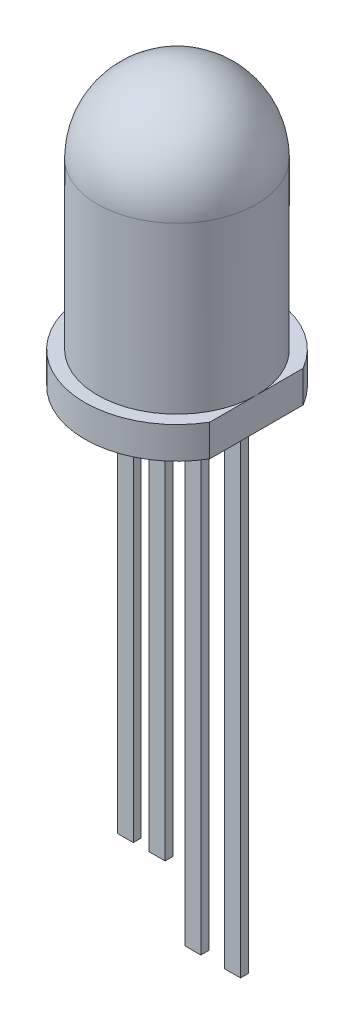
ISO-10303-21;
HEADER;
FILE_DESCRIPTION(('STEP AP214'),'2;1');
FILE_NAME('part.step','',(''),(''),'','','');
FILE_SCHEMA(('AUTOMOTIVE_DESIGN { 1 0 10303 214 1 1 1 1 }'));
ENDSEC;
DATA;
#1=APPLICATION_CONTEXT('core data for automotive mechanical design processes');
#2=APPLICATION_PROTOCOL_DEFINITION('international standard','automotive_design',2000,#1);
#3=PRODUCT_CONTEXT('',#1,'mechanical');
#4=PRODUCT('Part','Part','',(#3));
#5=PRODUCT_RELATED_PRODUCT_CATEGORY('part','',(#4));
#6=PRODUCT_DEFINITION_FORMATION('','',#4);
#7=PRODUCT_DEFINITION_CONTEXT('part definition',#1,'design');
#8=PRODUCT_DEFINITION('design','',#6,#7);
#9=PRODUCT_DEFINITION_SHAPE('','',#8);
#10=(LENGTH_UNIT() NAMED_UNIT(*) SI_UNIT(.MILLI.,.METRE.));
#11=(NAMED_UNIT(*) PLANE_ANGLE_UNIT() SI_UNIT($,.RADIAN.));
#12=(NAMED_UNIT(*) SI_UNIT($,.STERADIAN.) SOLID_ANGLE_UNIT());
#13=UNCERTAINTY_MEASURE_WITH_UNIT(LENGTH_MEASURE(1.E-05),#10,'distance_accuracy_value','');
#14=(GEOMETRIC_REPRESENTATION_CONTEXT(3) GLOBAL_UNCERTAINTY_ASSIGNED_CONTEXT((#13)) GLOBAL_UNIT_ASSIGNED_CONTEXT((#10,
#11,#12)) REPRESENTATION_CONTEXT('',''));
#15=CARTESIAN_POINT('',(0.,0.,0.));
#16=DIRECTION('',(0.,0.,1.));
#17=DIRECTION('',(1.,0.,0.));
#18=AXIS2_PLACEMENT_3D('',#15,#16,#17);
#19=CARTESIAN_POINT('',(0.,0.,0.));
#20=DIRECTION('',(0.,-1.,0.));
#21=DIRECTION('',(0.,0.,-1.));
#22=AXIS2_PLACEMENT_3D('',#19,#20,#21);
#23=PLANE('',#22);
#24=DIRECTION('',(-1.,0.,0.));
#25=VECTOR('',#24,1.);
#26=CARTESIAN_POINT('',(1.625,0.,0.125));
#27=LINE('',#26,#25);
#28=CARTESIAN_POINT('',(2.125,0.,0.125));
#29=VERTEX_POINT('',#28);
#30=CARTESIAN_POINT('',(1.625,0.,0.125));
#31=VERTEX_POINT('',#30);
#32=EDGE_CURVE('E237',#29,#31,#27,.T.);
#33=ORIENTED_EDGE('',*,*,#32,.F.);
#34=DIRECTION('',(0.,0.,-1.));
#35=VECTOR('',#34,1.);
#36=CARTESIAN_POINT('',(2.125,0.,0.125));
#37=LINE('',#36,#35);
#38=CARTESIAN_POINT('',(2.125,0.,-0.125));
#39=VERTEX_POINT('',#38);
#40=EDGE_CURVE('E250',#29,#39,#37,.T.);
#41=ORIENTED_EDGE('',*,*,#40,.T.);
#42=DIRECTION('',(-1.,0.,0.));
#43=VECTOR('',#42,1.);
#44=CARTESIAN_POINT('',(1.625,0.,-0.125));
#45=LINE('',#44,#43);
#46=CARTESIAN_POINT('',(1.625,0.,-0.125));
#47=VERTEX_POINT('',#46);
#48=EDGE_CURVE('E233',#39,#47,#45,.T.);
#49=ORIENTED_EDGE('',*,*,#48,.T.);
#50=DIRECTION('',(0.,0.,-1.));
#51=VECTOR('',#50,1.);
#52=CARTESIAN_POINT('',(1.625,0.,0.125));
#53=LINE('',#52,#51);
#54=EDGE_CURVE('E239',#31,#47,#53,.T.);
#55=ORIENTED_EDGE('',*,*,#54,.F.);
#56=EDGE_LOOP('',(#33,#41,#49,#55));
#57=FACE_BOUND('',#56,.T.);
#58=CARTESIAN_POINT('',(0.,0.,0.));
#59=DIRECTION('',(0.,-1.,0.));
#60=DIRECTION('',(0.,0.,-1.));
#61=AXIS2_PLACEMENT_3D('',#58,#59,#60);
#62=CIRCLE('',#61,2.9);
#63=CARTESIAN_POINT('',(2.5,0.,1.46969384566991));
#64=VERTEX_POINT('',#63);
#65=CARTESIAN_POINT('',(2.5,0.,-1.46969384566991));
#66=VERTEX_POINT('',#65);
#67=EDGE_CURVE('E301',#64,#66,#62,.T.);
#68=ORIENTED_EDGE('',*,*,#67,.T.);
#69=DIRECTION('',(0.,0.,1.));
#70=VECTOR('',#69,1.);
#71=CARTESIAN_POINT('',(2.5,0.,-1.46969384566991));
#72=LINE('',#71,#70);
#73=EDGE_CURVE('E289',#66,#64,#72,.T.);
#74=ORIENTED_EDGE('',*,*,#73,.T.);
#75=EDGE_LOOP('',(#68,#74));
#76=FACE_BOUND('',#75,.T.);
#77=DIRECTION('',(0.,0.,-1.));
#78=VECTOR('',#77,1.);
#79=CARTESIAN_POINT('',(0.375,0.,0.125));
#80=LINE('',#79,#78);
#81=CARTESIAN_POINT('',(0.375,0.,0.125));
#82=VERTEX_POINT('',#81);
#83=CARTESIAN_POINT('',(0.375,0.,-0.125));
#84=VERTEX_POINT('',#83);
#85=EDGE_CURVE('E284',#82,#84,#80,.T.);
#86=ORIENTED_EDGE('',*,*,#85,.F.);
#87=DIRECTION('',(-1.,0.,0.));
#88=VECTOR('',#87,1.);
#89=CARTESIAN_POINT('',(0.875,0.,0.125));
#90=LINE('',#89,#88);
#91=CARTESIAN_POINT('',(0.875,0.,0.125));
#92=VERTEX_POINT('',#91);
#93=EDGE_CURVE('E263',#92,#82,#90,.T.);
#94=ORIENTED_EDGE('',*,*,#93,.F.);
#95=DIRECTION('',(0.,0.,-1.));
#96=VECTOR('',#95,1.);
#97=CARTESIAN_POINT('',(0.875,0.,0.125));
#98=LINE('',#97,#96);
#99=CARTESIAN_POINT('',(0.875,0.,-0.125));
#100=VERTEX_POINT('',#99);
#101=EDGE_CURVE('E287',#92,#100,#98,.T.);
#102=ORIENTED_EDGE('',*,*,#101,.T.);
#103=DIRECTION('',(-1.,0.,0.));
#104=VECTOR('',#103,1.);
#105=CARTESIAN_POINT('',(0.875,0.,-0.125));
#106=LINE('',#105,#104);
#107=EDGE_CURVE('E274',#100,#84,#106,.T.);
#108=ORIENTED_EDGE('',*,*,#107,.T.);
#109=EDGE_LOOP('',(#86,#94,#102,#108));
#110=FACE_BOUND('',#109,.T.);
#111=DIRECTION('',(0.,0.,-1.));
#112=VECTOR('',#111,1.);
#113=CARTESIAN_POINT('',(-0.75,0.,0.125));
#114=LINE('',#113,#112);
#115=CARTESIAN_POINT('',(-0.75,0.,0.125));
#116=VERTEX_POINT('',#115);
#117=CARTESIAN_POINT('',(-0.75,0.,-0.125));
#118=VERTEX_POINT('',#117);
#119=EDGE_CURVE('E223',#116,#118,#114,.T.);
#120=ORIENTED_EDGE('',*,*,#119,.F.);
#121=DIRECTION('',(-1.,0.,0.));
#122=VECTOR('',#121,1.);
#123=CARTESIAN_POINT('',(-0.25,0.,0.125));
#124=LINE('',#123,#122);
#125=CARTESIAN_POINT('',(-0.25,0.,0.125));
#126=VERTEX_POINT('',#125);
#127=EDGE_CURVE('E202',#126,#116,#124,.T.);
#128=ORIENTED_EDGE('',*,*,#127,.F.);
#129=DIRECTION('',(0.,0.,-1.));
#130=VECTOR('',#129,1.);
#131=CARTESIAN_POINT('',(-0.25,0.,0.125));
#132=LINE('',#131,#130);
#133=CARTESIAN_POINT('',(-0.25,0.,-0.125));
#134=VERTEX_POINT('',#133);
#135=EDGE_CURVE('E226',#126,#134,#132,.T.);
#136=ORIENTED_EDGE('',*,*,#135,.T.);
#137=DIRECTION('',(-1.,0.,0.));
#138=VECTOR('',#137,1.);
#139=CARTESIAN_POINT('',(-0.25,0.,-0.125));
#140=LINE('',#139,#138);
#141=EDGE_CURVE('E213',#134,#118,#140,.T.);
#142=ORIENTED_EDGE('',*,*,#141,.T.);
#143=EDGE_LOOP('',(#120,#128,#136,#142));
#144=FACE_BOUND('',#143,.T.);
#145=DIRECTION('',(0.,0.,-1.));
#146=VECTOR('',#145,1.);
#147=CARTESIAN_POINT('',(-1.75,0.,0.125));
#148=LINE('',#147,#146);
#149=CARTESIAN_POINT('',(-1.75,0.,0.125));
#150=VERTEX_POINT('',#149);
#151=CARTESIAN_POINT('',(-1.75,0.,-0.125));
#152=VERTEX_POINT('',#151);
#153=EDGE_CURVE('E57',#150,#152,#148,.T.);
#154=ORIENTED_EDGE('',*,*,#153,.F.);
#155=DIRECTION('',(-1.,0.,0.));
#156=VECTOR('',#155,1.);
#157=CARTESIAN_POINT('',(-1.25,0.,0.125));
#158=LINE('',#157,#156);
#159=CARTESIAN_POINT('',(-1.25,0.,0.125));
#160=VERTEX_POINT('',#159);
#161=EDGE_CURVE('E52',#160,#150,#158,.T.);
#162=ORIENTED_EDGE('',*,*,#161,.F.);
#163=DIRECTION('',(0.,0.,-1.));
#164=VECTOR('',#163,1.);
#165=CARTESIAN_POINT('',(-1.25,0.,0.125));
#166=LINE('',#165,#164);
#167=CARTESIAN_POINT('',(-1.25,0.,-0.125));
#168=VERTEX_POINT('',#167);
#169=EDGE_CURVE('E196',#160,#168,#166,.T.);
#170=ORIENTED_EDGE('',*,*,#169,.T.);
#171=DIRECTION('',(-1.,0.,0.));
#172=VECTOR('',#171,1.);
#173=CARTESIAN_POINT('',(-1.25,0.,-0.125));
#174=LINE('',#173,#172);
#175=EDGE_CURVE('E189',#168,#152,#174,.T.);
#176=ORIENTED_EDGE('',*,*,#175,.T.);
#177=EDGE_LOOP('',(#154,#162,#170,#176));
#178=FACE_BOUND('',#177,.T.);
#179=ADVANCED_FACE('F37',(#57,#76,#110,#144,#178),#23,.T.);
#180=CARTESIAN_POINT('',(0.,1.,-2.9));
#181=DIRECTION('',(0.,1.,0.));
#182=DIRECTION('',(0.,0.,1.));
#183=AXIS2_PLACEMENT_3D('',#180,#181,#182);
#184=PLANE('',#183);
#185=CARTESIAN_POINT('',(0.,1.,0.));
#186=DIRECTION('',(0.,-1.,0.));
#187=DIRECTION('',(0.,0.,-1.));
#188=AXIS2_PLACEMENT_3D('',#185,#186,#187);
#189=CIRCLE('',#188,2.9);
#190=CARTESIAN_POINT('',(2.5,1.,1.46969384566991));
#191=VERTEX_POINT('',#190);
#192=CARTESIAN_POINT('',(2.5,1.,-1.46969384566991));
#193=VERTEX_POINT('',#192);
#194=EDGE_CURVE('E304',#191,#193,#189,.T.);
#195=ORIENTED_EDGE('',*,*,#194,.F.);
#196=DIRECTION('',(0.,0.,-1.));
#197=VECTOR('',#196,1.);
#198=CARTESIAN_POINT('',(2.5,1.,-2.9));
#199=LINE('',#198,#197);
#200=CARTESIAN_POINT('',(2.5,1.,0.));
#201=VERTEX_POINT('',#200);
#202=EDGE_CURVE('E300',#191,#201,#199,.T.);
#203=ORIENTED_EDGE('',*,*,#202,.T.);
#204=CARTESIAN_POINT('',(0.,1.,0.));
#205=DIRECTION('',(0.,-1.,0.));
#206=DIRECTION('',(0.,0.,-1.));
#207=AXIS2_PLACEMENT_3D('',#204,#205,#206);
#208=CIRCLE('',#207,2.5);
#209=EDGE_CURVE('E45',#201,#201,#208,.T.);
#210=ORIENTED_EDGE('',*,*,#209,.T.);
#211=EDGE_CURVE('E297',#201,#193,#199,.T.);
#212=ORIENTED_EDGE('',*,*,#211,.T.);
#213=EDGE_LOOP('',(#195,#203,#210,#212));
#214=FACE_BOUND('',#213,.T.);
#215=ADVANCED_FACE('F311',(#214),#184,.T.);
#216=CARTESIAN_POINT('',(0.,0.,0.));
#217=DIRECTION('',(0.,-1.,0.));
#218=DIRECTION('',(0.,0.,-1.));
#219=AXIS2_PLACEMENT_3D('',#216,#217,#218);
#220=CYLINDRICAL_SURFACE('',#219,2.9);
#221=ORIENTED_EDGE('',*,*,#67,.F.);
#222=DIRECTION('',(0.,-1.,0.));
#223=VECTOR('',#222,1.);
#224=CARTESIAN_POINT('',(2.5,8.7,1.46969384566991));
#225=LINE('',#224,#223);
#226=EDGE_CURVE('E295',#191,#64,#225,.T.);
#227=ORIENTED_EDGE('',*,*,#226,.F.);
#228=ORIENTED_EDGE('',*,*,#194,.T.);
#229=DIRECTION('',(0.,-1.,0.));
#230=VECTOR('',#229,1.);
#231=CARTESIAN_POINT('',(2.5,8.7,-1.46969384566991));
#232=LINE('',#231,#230);
#233=EDGE_CURVE('E292',#193,#66,#232,.T.);
#234=ORIENTED_EDGE('',*,*,#233,.T.);
#235=EDGE_LOOP('',(#221,#227,#228,#234));
#236=FACE_BOUND('',#235,.T.);
#237=ADVANCED_FACE('F324',(#236),#220,.T.);
#238=CARTESIAN_POINT('',(0.,6.2,0.));
#239=DIRECTION('',(0.,-1.,0.));
#240=DIRECTION('',(0.,0.,-1.));
#241=AXIS2_PLACEMENT_3D('',#238,#239,#240);
#242=SPHERICAL_SURFACE('',#241,2.5);
#243=CARTESIAN_POINT('',(0.,6.2,0.));
#244=DIRECTION('',(0.,-1.,0.));
#245=DIRECTION('',(0.,0.,-1.));
#246=AXIS2_PLACEMENT_3D('',#243,#244,#245);
#247=CIRCLE('',#246,2.5);
#248=CARTESIAN_POINT('',(0.,6.2,-2.5));
#249=VERTEX_POINT('',#248);
#250=EDGE_CURVE('E11',#249,#249,#247,.T.);
#251=ORIENTED_EDGE('',*,*,#250,.F.);
#252=EDGE_LOOP('',(#251));
#253=FACE_BOUND('',#252,.T.);
#254=ADVANCED_FACE('F39',(#253),#242,.T.);
#255=CARTESIAN_POINT('',(0.,0.,0.));
#256=DIRECTION('',(0.,-1.,0.));
#257=DIRECTION('',(0.,0.,-1.));
#258=AXIS2_PLACEMENT_3D('',#255,#256,#257);
#259=CYLINDRICAL_SURFACE('',#258,2.5);
#260=ORIENTED_EDGE('',*,*,#250,.T.);
#261=EDGE_LOOP('',(#260));
#262=FACE_BOUND('',#261,.T.);
#263=ORIENTED_EDGE('',*,*,#209,.F.);
#264=EDGE_LOOP('',(#263));
#265=FACE_BOUND('',#264,.T.);
#266=ADVANCED_FACE('F313',(#262,#265),#259,.T.);
#267=CARTESIAN_POINT('',(2.5,8.7,-1.46969384566991));
#268=DIRECTION('',(1.,0.,0.));
#269=DIRECTION('',(0.,0.,-1.));
#270=AXIS2_PLACEMENT_3D('',#267,#268,#269);
#271=PLANE('',#270);
#272=ORIENTED_EDGE('',*,*,#226,.T.);
#273=ORIENTED_EDGE('',*,*,#73,.F.);
#274=ORIENTED_EDGE('',*,*,#233,.F.);
#275=ORIENTED_EDGE('',*,*,#211,.F.);
#276=ORIENTED_EDGE('',*,*,#202,.F.);
#277=EDGE_LOOP('',(#272,#273,#274,#275,#276));
#278=FACE_BOUND('',#277,.T.);
#279=ADVANCED_FACE('F315',(#278),#271,.T.);
#280=CARTESIAN_POINT('',(0.875,0.,0.125));
#281=DIRECTION('',(-1.,0.,0.));
#282=DIRECTION('',(0.,-1.,0.));
#283=AXIS2_PLACEMENT_3D('',#280,#281,#282);
#284=PLANE('',#283);
#285=DIRECTION('',(0.,1.,0.));
#286=VECTOR('',#285,1.);
#287=CARTESIAN_POINT('',(0.875,0.,-0.125));
#288=LINE('',#287,#286);
#289=CARTESIAN_POINT('',(0.875000000000002,-15.,-0.125));
#290=VERTEX_POINT('',#289);
#291=EDGE_CURVE('E259',#290,#100,#288,.T.);
#292=ORIENTED_EDGE('',*,*,#291,.T.);
#293=ORIENTED_EDGE('',*,*,#101,.F.);
#294=DIRECTION('',(0.,1.,0.));
#295=VECTOR('',#294,1.);
#296=CARTESIAN_POINT('',(0.875,0.,0.125));
#297=LINE('',#296,#295);
#298=CARTESIAN_POINT('',(0.875000000000002,-15.,0.125));
#299=VERTEX_POINT('',#298);
#300=EDGE_CURVE('E260',#299,#92,#297,.T.);
#301=ORIENTED_EDGE('',*,*,#300,.F.);
#302=DIRECTION('',(0.,0.,-1.));
#303=VECTOR('',#302,1.);
#304=CARTESIAN_POINT('',(0.875000000000002,-15.,0.125));
#305=LINE('',#304,#303);
#306=EDGE_CURVE('E271',#299,#290,#305,.T.);
#307=ORIENTED_EDGE('',*,*,#306,.T.);
#308=EDGE_LOOP('',(#292,#293,#301,#307));
#309=FACE_BOUND('',#308,.T.);
#310=ADVANCED_FACE('F321',(#309),#284,.F.);
#311=CARTESIAN_POINT('',(0.375,0.,0.125));
#312=DIRECTION('',(1.,0.,0.));
#313=DIRECTION('',(0.,1.,0.));
#314=AXIS2_PLACEMENT_3D('',#311,#312,#313);
#315=PLANE('',#314);
#316=DIRECTION('',(0.,-1.,0.));
#317=VECTOR('',#316,1.);
#318=CARTESIAN_POINT('',(0.375,0.,-0.125));
#319=LINE('',#318,#317);
#320=CARTESIAN_POINT('',(0.375000000000002,-15.,-0.125));
#321=VERTEX_POINT('',#320);
#322=EDGE_CURVE('E276',#84,#321,#319,.T.);
#323=ORIENTED_EDGE('',*,*,#322,.T.);
#324=DIRECTION('',(0.,0.,-1.));
#325=VECTOR('',#324,1.);
#326=CARTESIAN_POINT('',(0.375000000000002,-15.,0.125));
#327=LINE('',#326,#325);
#328=CARTESIAN_POINT('',(0.375000000000002,-15.,0.125));
#329=VERTEX_POINT('',#328);
#330=EDGE_CURVE('E281',#329,#321,#327,.T.);
#331=ORIENTED_EDGE('',*,*,#330,.F.);
#332=DIRECTION('',(0.,-1.,0.));
#333=VECTOR('',#332,1.);
#334=CARTESIAN_POINT('',(0.375,0.,0.125));
#335=LINE('',#334,#333);
#336=EDGE_CURVE('E267',#82,#329,#335,.T.);
#337=ORIENTED_EDGE('',*,*,#336,.F.);
#338=ORIENTED_EDGE('',*,*,#85,.T.);
#339=EDGE_LOOP('',(#323,#331,#337,#338));
#340=FACE_BOUND('',#339,.T.);
#341=ADVANCED_FACE('F413',(#340),#315,.F.);
#342=CARTESIAN_POINT('',(0.875000000000002,-15.,0.125));
#343=DIRECTION('',(0.,1.,0.));
#344=DIRECTION('',(0.,0.,1.));
#345=AXIS2_PLACEMENT_3D('',#342,#343,#344);
#346=PLANE('',#345);
#347=DIRECTION('',(1.,0.,0.));
#348=VECTOR('',#347,1.);
#349=CARTESIAN_POINT('',(0.875000000000002,-15.,-0.125));
#350=LINE('',#349,#348);
#351=EDGE_CURVE('E264',#321,#290,#350,.T.);
#352=ORIENTED_EDGE('',*,*,#351,.T.);
#353=ORIENTED_EDGE('',*,*,#306,.F.);
#354=DIRECTION('',(1.,0.,0.));
#355=VECTOR('',#354,1.);
#356=CARTESIAN_POINT('',(0.875000000000002,-15.,0.125));
#357=LINE('',#356,#355);
#358=EDGE_CURVE('E269',#329,#299,#357,.T.);
#359=ORIENTED_EDGE('',*,*,#358,.F.);
#360=ORIENTED_EDGE('',*,*,#330,.T.);
#361=EDGE_LOOP('',(#352,#353,#359,#360));
#362=FACE_BOUND('',#361,.T.);
#363=ADVANCED_FACE('F406',(#362),#346,.F.);
#364=CARTESIAN_POINT('',(0.,0.,0.125));
#365=DIRECTION('',(0.,0.,-1.));
#366=DIRECTION('',(-1.,0.,0.));
#367=AXIS2_PLACEMENT_3D('',#364,#365,#366);
#368=PLANE('',#367);
#369=ORIENTED_EDGE('',*,*,#300,.T.);
#370=ORIENTED_EDGE('',*,*,#93,.T.);
#371=ORIENTED_EDGE('',*,*,#336,.T.);
#372=ORIENTED_EDGE('',*,*,#358,.T.);
#373=EDGE_LOOP('',(#369,#370,#371,#372));
#374=FACE_BOUND('',#373,.T.);
#375=ADVANCED_FACE('F403',(#374),#368,.F.);
#376=CARTESIAN_POINT('',(0.,0.,-0.125));
#377=DIRECTION('',(0.,0.,-1.));
#378=DIRECTION('',(-1.,0.,0.));
#379=AXIS2_PLACEMENT_3D('',#376,#377,#378);
#380=PLANE('',#379);
#381=ORIENTED_EDGE('',*,*,#291,.F.);
#382=ORIENTED_EDGE('',*,*,#351,.F.);
#383=ORIENTED_EDGE('',*,*,#322,.F.);
#384=ORIENTED_EDGE('',*,*,#107,.F.);
#385=EDGE_LOOP('',(#381,#382,#383,#384));
#386=FACE_BOUND('',#385,.T.);
#387=ADVANCED_FACE('F401',(#386),#380,.T.);
#388=CARTESIAN_POINT('',(1.625,0.,0.125));
#389=DIRECTION('',(1.,0.,0.));
#390=DIRECTION('',(0.,1.,0.));
#391=AXIS2_PLACEMENT_3D('',#388,#389,#390);
#392=PLANE('',#391);
#393=DIRECTION('',(0.,-1.,0.));
#394=VECTOR('',#393,1.);
#395=CARTESIAN_POINT('',(1.625,0.,-0.125));
#396=LINE('',#395,#394);
#397=CARTESIAN_POINT('',(1.625,-15.,-0.125));
#398=VERTEX_POINT('',#397);
#399=EDGE_CURVE('E228',#47,#398,#396,.T.);
#400=ORIENTED_EDGE('',*,*,#399,.T.);
#401=DIRECTION('',(0.,0.,-1.));
#402=VECTOR('',#401,1.);
#403=CARTESIAN_POINT('',(1.625,-15.,0.125));
#404=LINE('',#403,#402);
#405=CARTESIAN_POINT('',(1.625,-15.,0.125));
#406=VERTEX_POINT('',#405);
#407=EDGE_CURVE('E256',#406,#398,#404,.T.);
#408=ORIENTED_EDGE('',*,*,#407,.F.);
#409=DIRECTION('',(0.,-1.,0.));
#410=VECTOR('',#409,1.);
#411=CARTESIAN_POINT('',(1.625,0.,0.125));
#412=LINE('',#411,#410);
#413=EDGE_CURVE('E229',#31,#406,#412,.T.);
#414=ORIENTED_EDGE('',*,*,#413,.F.);
#415=ORIENTED_EDGE('',*,*,#54,.T.);
#416=EDGE_LOOP('',(#400,#408,#414,#415));
#417=FACE_BOUND('',#416,.T.);
#418=ADVANCED_FACE('F397',(#417),#392,.F.);
#419=CARTESIAN_POINT('',(1.625,-15.,0.125));
#420=DIRECTION('',(0.,1.,0.));
#421=DIRECTION('',(0.,0.,1.));
#422=AXIS2_PLACEMENT_3D('',#419,#420,#421);
#423=PLANE('',#422);
#424=DIRECTION('',(1.,0.,0.));
#425=VECTOR('',#424,1.);
#426=CARTESIAN_POINT('',(1.625,-15.,-0.125));
#427=LINE('',#426,#425);
#428=CARTESIAN_POINT('',(2.125,-15.,-0.125));
#429=VERTEX_POINT('',#428);
#430=EDGE_CURVE('E242',#398,#429,#427,.T.);
#431=ORIENTED_EDGE('',*,*,#430,.T.);
#432=DIRECTION('',(0.,0.,-1.));
#433=VECTOR('',#432,1.);
#434=CARTESIAN_POINT('',(2.125,-15.,0.125));
#435=LINE('',#434,#433);
#436=CARTESIAN_POINT('',(2.125,-15.,0.125));
#437=VERTEX_POINT('',#436);
#438=EDGE_CURVE('E253',#437,#429,#435,.T.);
#439=ORIENTED_EDGE('',*,*,#438,.F.);
#440=DIRECTION('',(1.,0.,0.));
#441=VECTOR('',#440,1.);
#442=CARTESIAN_POINT('',(1.625,-15.,0.125));
#443=LINE('',#442,#441);
#444=EDGE_CURVE('E232',#406,#437,#443,.T.);
#445=ORIENTED_EDGE('',*,*,#444,.F.);
#446=ORIENTED_EDGE('',*,*,#407,.T.);
#447=EDGE_LOOP('',(#431,#439,#445,#446));
#448=FACE_BOUND('',#447,.T.);
#449=ADVANCED_FACE('F393',(#448),#423,.F.);
#450=CARTESIAN_POINT('',(2.125,0.,0.125));
#451=DIRECTION('',(-1.,0.,0.));
#452=DIRECTION('',(0.,-1.,0.));
#453=AXIS2_PLACEMENT_3D('',#450,#451,#452);
#454=PLANE('',#453);
#455=DIRECTION('',(0.,1.,0.));
#456=VECTOR('',#455,1.);
#457=CARTESIAN_POINT('',(2.125,0.,-0.125));
#458=LINE('',#457,#456);
#459=EDGE_CURVE('E244',#429,#39,#458,.T.);
#460=ORIENTED_EDGE('',*,*,#459,.T.);
#461=ORIENTED_EDGE('',*,*,#40,.F.);
#462=DIRECTION('',(0.,1.,0.));
#463=VECTOR('',#462,1.);
#464=CARTESIAN_POINT('',(2.125,0.,0.125));
#465=LINE('',#464,#463);
#466=EDGE_CURVE('E235',#437,#29,#465,.T.);
#467=ORIENTED_EDGE('',*,*,#466,.F.);
#468=ORIENTED_EDGE('',*,*,#438,.T.);
#469=EDGE_LOOP('',(#460,#461,#467,#468));
#470=FACE_BOUND('',#469,.T.);
#471=ADVANCED_FACE('F386',(#470),#454,.F.);
#472=CARTESIAN_POINT('',(0.,0.,0.125));
#473=DIRECTION('',(0.,0.,1.));
#474=DIRECTION('',(1.,0.,0.));
#475=AXIS2_PLACEMENT_3D('',#472,#473,#474);
#476=PLANE('',#475);
#477=ORIENTED_EDGE('',*,*,#413,.T.);
#478=ORIENTED_EDGE('',*,*,#444,.T.);
#479=ORIENTED_EDGE('',*,*,#466,.T.);
#480=ORIENTED_EDGE('',*,*,#32,.T.);
#481=EDGE_LOOP('',(#477,#478,#479,#480));
#482=FACE_BOUND('',#481,.T.);
#483=ADVANCED_FACE('F383',(#482),#476,.T.);
#484=CARTESIAN_POINT('',(0.,0.,-0.125));
#485=DIRECTION('',(0.,0.,1.));
#486=DIRECTION('',(1.,0.,0.));
#487=AXIS2_PLACEMENT_3D('',#484,#485,#486);
#488=PLANE('',#487);
#489=ORIENTED_EDGE('',*,*,#399,.F.);
#490=ORIENTED_EDGE('',*,*,#48,.F.);
#491=ORIENTED_EDGE('',*,*,#459,.F.);
#492=ORIENTED_EDGE('',*,*,#430,.F.);
#493=EDGE_LOOP('',(#489,#490,#491,#492));
#494=FACE_BOUND('',#493,.T.);
#495=ADVANCED_FACE('F382',(#494),#488,.F.);
#496=CARTESIAN_POINT('',(-0.25,0.,0.125));
#497=DIRECTION('',(-1.,0.,0.));
#498=DIRECTION('',(0.,-1.,0.));
#499=AXIS2_PLACEMENT_3D('',#496,#497,#498);
#500=PLANE('',#499);
#501=DIRECTION('',(0.,1.,0.));
#502=VECTOR('',#501,1.);
#503=CARTESIAN_POINT('',(-0.25,0.,-0.125));
#504=LINE('',#503,#502);
#505=CARTESIAN_POINT('',(-0.249999999999997,-13.,-0.125));
#506=VERTEX_POINT('',#505);
#507=EDGE_CURVE('E198',#506,#134,#504,.T.);
#508=ORIENTED_EDGE('',*,*,#507,.T.);
#509=ORIENTED_EDGE('',*,*,#135,.F.);
#510=DIRECTION('',(0.,1.,0.));
#511=VECTOR('',#510,1.);
#512=CARTESIAN_POINT('',(-0.25,0.,0.125));
#513=LINE('',#512,#511);
#514=CARTESIAN_POINT('',(-0.249999999999997,-13.,0.125));
#515=VERTEX_POINT('',#514);
#516=EDGE_CURVE('E199',#515,#126,#513,.T.);
#517=ORIENTED_EDGE('',*,*,#516,.F.);
#518=DIRECTION('',(0.,0.,-1.));
#519=VECTOR('',#518,1.);
#520=CARTESIAN_POINT('',(-0.249999999999997,-13.,0.125));
#521=LINE('',#520,#519);
#522=EDGE_CURVE('E210',#515,#506,#521,.T.);
#523=ORIENTED_EDGE('',*,*,#522,.T.);
#524=EDGE_LOOP('',(#508,#509,#517,#523));
#525=FACE_BOUND('',#524,.T.);
#526=ADVANCED_FACE('F362',(#525),#500,.F.);
#527=CARTESIAN_POINT('',(-0.75,0.,0.125));
#528=DIRECTION('',(1.,0.,0.));
#529=DIRECTION('',(0.,1.,0.));
#530=AXIS2_PLACEMENT_3D('',#527,#528,#529);
#531=PLANE('',#530);
#532=DIRECTION('',(0.,-1.,0.));
#533=VECTOR('',#532,1.);
#534=CARTESIAN_POINT('',(-0.75,0.,-0.125));
#535=LINE('',#534,#533);
#536=CARTESIAN_POINT('',(-0.749999999999998,-13.,-0.125));
#537=VERTEX_POINT('',#536);
#538=EDGE_CURVE('E215',#118,#537,#535,.T.);
#539=ORIENTED_EDGE('',*,*,#538,.T.);
#540=DIRECTION('',(0.,0.,-1.));
#541=VECTOR('',#540,1.);
#542=CARTESIAN_POINT('',(-0.749999999999998,-13.,0.125));
#543=LINE('',#542,#541);
#544=CARTESIAN_POINT('',(-0.749999999999998,-13.,0.125));
#545=VERTEX_POINT('',#544);
#546=EDGE_CURVE('E220',#545,#537,#543,.T.);
#547=ORIENTED_EDGE('',*,*,#546,.F.);
#548=DIRECTION('',(0.,-1.,0.));
#549=VECTOR('',#548,1.);
#550=CARTESIAN_POINT('',(-0.75,0.,0.125));
#551=LINE('',#550,#549);
#552=EDGE_CURVE('E206',#116,#545,#551,.T.);
#553=ORIENTED_EDGE('',*,*,#552,.F.);
#554=ORIENTED_EDGE('',*,*,#119,.T.);
#555=EDGE_LOOP('',(#539,#547,#553,#554));
#556=FACE_BOUND('',#555,.T.);
#557=ADVANCED_FACE('F354',(#556),#531,.F.);
#558=CARTESIAN_POINT('',(-0.249999999999997,-13.,0.125));
#559=DIRECTION('',(0.,1.,0.));
#560=DIRECTION('',(0.,0.,1.));
#561=AXIS2_PLACEMENT_3D('',#558,#559,#560);
#562=PLANE('',#561);
#563=DIRECTION('',(1.,0.,0.));
#564=VECTOR('',#563,1.);
#565=CARTESIAN_POINT('',(-0.249999999999997,-13.,-0.125));
#566=LINE('',#565,#564);
#567=EDGE_CURVE('E203',#537,#506,#566,.T.);
#568=ORIENTED_EDGE('',*,*,#567,.T.);
#569=ORIENTED_EDGE('',*,*,#522,.F.);
#570=DIRECTION('',(1.,0.,0.));
#571=VECTOR('',#570,1.);
#572=CARTESIAN_POINT('',(-0.249999999999997,-13.,0.125));
#573=LINE('',#572,#571);
#574=EDGE_CURVE('E208',#545,#515,#573,.T.);
#575=ORIENTED_EDGE('',*,*,#574,.F.);
#576=ORIENTED_EDGE('',*,*,#546,.T.);
#577=EDGE_LOOP('',(#568,#569,#575,#576));
#578=FACE_BOUND('',#577,.T.);
#579=ADVANCED_FACE('F359',(#578),#562,.F.);
#580=CARTESIAN_POINT('',(0.,0.,0.125));
#581=DIRECTION('',(0.,0.,-1.));
#582=DIRECTION('',(-1.,0.,0.));
#583=AXIS2_PLACEMENT_3D('',#580,#581,#582);
#584=PLANE('',#583);
#585=ORIENTED_EDGE('',*,*,#516,.T.);
#586=ORIENTED_EDGE('',*,*,#127,.T.);
#587=ORIENTED_EDGE('',*,*,#552,.T.);
#588=ORIENTED_EDGE('',*,*,#574,.T.);
#589=EDGE_LOOP('',(#585,#586,#587,#588));
#590=FACE_BOUND('',#589,.T.);
#591=ADVANCED_FACE('F350',(#590),#584,.F.);
#592=CARTESIAN_POINT('',(0.,0.,-0.125));
#593=DIRECTION('',(0.,0.,-1.));
#594=DIRECTION('',(-1.,0.,0.));
#595=AXIS2_PLACEMENT_3D('',#592,#593,#594);
#596=PLANE('',#595);
#597=ORIENTED_EDGE('',*,*,#507,.F.);
#598=ORIENTED_EDGE('',*,*,#567,.F.);
#599=ORIENTED_EDGE('',*,*,#538,.F.);
#600=ORIENTED_EDGE('',*,*,#141,.F.);
#601=EDGE_LOOP('',(#597,#598,#599,#600));
#602=FACE_BOUND('',#601,.T.);
#603=ADVANCED_FACE('F364',(#602),#596,.T.);
#604=CARTESIAN_POINT('',(-1.25,0.,0.125));
#605=DIRECTION('',(-1.,0.,0.));
#606=DIRECTION('',(0.,-1.,0.));
#607=AXIS2_PLACEMENT_3D('',#604,#605,#606);
#608=PLANE('',#607);
#609=DIRECTION('',(0.,1.,0.));
#610=VECTOR('',#609,1.);
#611=CARTESIAN_POINT('',(-1.25,0.,-0.125));
#612=LINE('',#611,#610);
#613=CARTESIAN_POINT('',(-1.25,-13.,-0.125));
#614=VERTEX_POINT('',#613);
#615=EDGE_CURVE('E186',#614,#168,#612,.T.);
#616=ORIENTED_EDGE('',*,*,#615,.T.);
#617=ORIENTED_EDGE('',*,*,#169,.F.);
#618=DIRECTION('',(0.,1.,0.));
#619=VECTOR('',#618,1.);
#620=CARTESIAN_POINT('',(-1.25,0.,0.125));
#621=LINE('',#620,#619);
#622=CARTESIAN_POINT('',(-1.25,-13.,0.125));
#623=VERTEX_POINT('',#622);
#624=EDGE_CURVE('E193',#623,#160,#621,.T.);
#625=ORIENTED_EDGE('',*,*,#624,.F.);
#626=DIRECTION('',(0.,0.,-1.));
#627=VECTOR('',#626,1.);
#628=CARTESIAN_POINT('',(-1.25,-13.,0.125));
#629=LINE('',#628,#627);
#630=EDGE_CURVE('E177',#623,#614,#629,.T.);
#631=ORIENTED_EDGE('',*,*,#630,.T.);
#632=EDGE_LOOP('',(#616,#617,#625,#631));
#633=FACE_BOUND('',#632,.T.);
#634=ADVANCED_FACE('F366',(#633),#608,.F.);
#635=CARTESIAN_POINT('',(-1.75,0.,0.125));
#636=DIRECTION('',(1.,0.,0.));
#637=DIRECTION('',(0.,1.,0.));
#638=AXIS2_PLACEMENT_3D('',#635,#636,#637);
#639=PLANE('',#638);
#640=DIRECTION('',(0.,-1.,0.));
#641=VECTOR('',#640,1.);
#642=CARTESIAN_POINT('',(-1.75,0.,-0.125));
#643=LINE('',#642,#641);
#644=CARTESIAN_POINT('',(-1.75,-13.,-0.125));
#645=VERTEX_POINT('',#644);
#646=EDGE_CURVE('E174',#152,#645,#643,.T.);
#647=ORIENTED_EDGE('',*,*,#646,.T.);
#648=DIRECTION('',(0.,0.,-1.));
#649=VECTOR('',#648,1.);
#650=CARTESIAN_POINT('',(-1.75,-13.,0.125));
#651=LINE('',#650,#649);
#652=CARTESIAN_POINT('',(-1.75,-13.,0.125));
#653=VERTEX_POINT('',#652);
#654=EDGE_CURVE('E171',#653,#645,#651,.T.);
#655=ORIENTED_EDGE('',*,*,#654,.F.);
#656=DIRECTION('',(0.,-1.,0.));
#657=VECTOR('',#656,1.);
#658=CARTESIAN_POINT('',(-1.75,0.,0.125));
#659=LINE('',#658,#657);
#660=EDGE_CURVE('E162',#150,#653,#659,.T.);
#661=ORIENTED_EDGE('',*,*,#660,.F.);
#662=ORIENTED_EDGE('',*,*,#153,.T.);
#663=EDGE_LOOP('',(#647,#655,#661,#662));
#664=FACE_BOUND('',#663,.T.);
#665=ADVANCED_FACE('F172',(#664),#639,.F.);
#666=CARTESIAN_POINT('',(-1.25,-13.,0.125));
#667=DIRECTION('',(0.,1.,0.));
#668=DIRECTION('',(0.,0.,1.));
#669=AXIS2_PLACEMENT_3D('',#666,#667,#668);
#670=PLANE('',#669);
#671=DIRECTION('',(1.,0.,0.));
#672=VECTOR('',#671,1.);
#673=CARTESIAN_POINT('',(-1.25,-13.,-0.125));
#674=LINE('',#673,#672);
#675=EDGE_CURVE('E192',#645,#614,#674,.T.);
#676=ORIENTED_EDGE('',*,*,#675,.T.);
#677=ORIENTED_EDGE('',*,*,#630,.F.);
#678=DIRECTION('',(1.,0.,0.));
#679=VECTOR('',#678,1.);
#680=CARTESIAN_POINT('',(-1.25,-13.,0.125));
#681=LINE('',#680,#679);
#682=EDGE_CURVE('E166',#653,#623,#681,.T.);
#683=ORIENTED_EDGE('',*,*,#682,.F.);
#684=ORIENTED_EDGE('',*,*,#654,.T.);
#685=EDGE_LOOP('',(#676,#677,#683,#684));
#686=FACE_BOUND('',#685,.T.);
#687=ADVANCED_FACE('F179',(#686),#670,.F.);
#688=CARTESIAN_POINT('',(0.,0.,0.125));
#689=DIRECTION('',(0.,0.,-1.));
#690=DIRECTION('',(-1.,0.,0.));
#691=AXIS2_PLACEMENT_3D('',#688,#689,#690);
#692=PLANE('',#691);
#693=ORIENTED_EDGE('',*,*,#624,.T.);
#694=ORIENTED_EDGE('',*,*,#161,.T.);
#695=ORIENTED_EDGE('',*,*,#660,.T.);
#696=ORIENTED_EDGE('',*,*,#682,.T.);
#697=EDGE_LOOP('',(#693,#694,#695,#696));
#698=FACE_BOUND('',#697,.T.);
#699=ADVANCED_FACE('F164',(#698),#692,.F.);
#700=CARTESIAN_POINT('',(0.,0.,-0.125));
#701=DIRECTION('',(0.,0.,-1.));
#702=DIRECTION('',(-1.,0.,0.));
#703=AXIS2_PLACEMENT_3D('',#700,#701,#702);
#704=PLANE('',#703);
#705=ORIENTED_EDGE('',*,*,#615,.F.);
#706=ORIENTED_EDGE('',*,*,#675,.F.);
#707=ORIENTED_EDGE('',*,*,#646,.F.);
#708=ORIENTED_EDGE('',*,*,#175,.F.);
#709=EDGE_LOOP('',(#705,#706,#707,#708));
#710=FACE_BOUND('',#709,.T.);
#711=ADVANCED_FACE('F520',(#710),#704,.T.);
#712=CLOSED_SHELL('',(#179,#215,#237,#254,#266,#279,#310,#341,#363,#375,#387,#418,#449,#471,
#483,#495,#526,#557,#579,#591,#603,#634,#665,#687,#699,#711));
#713=MANIFOLD_SOLID_BREP('B2',#712);
#714=ADVANCED_BREP_SHAPE_REPRESENTATION('',(#18,#713),#14);
#715=SHAPE_DEFINITION_REPRESENTATION(#9,#714);
ENDSEC;
END-ISO-10303-21;
